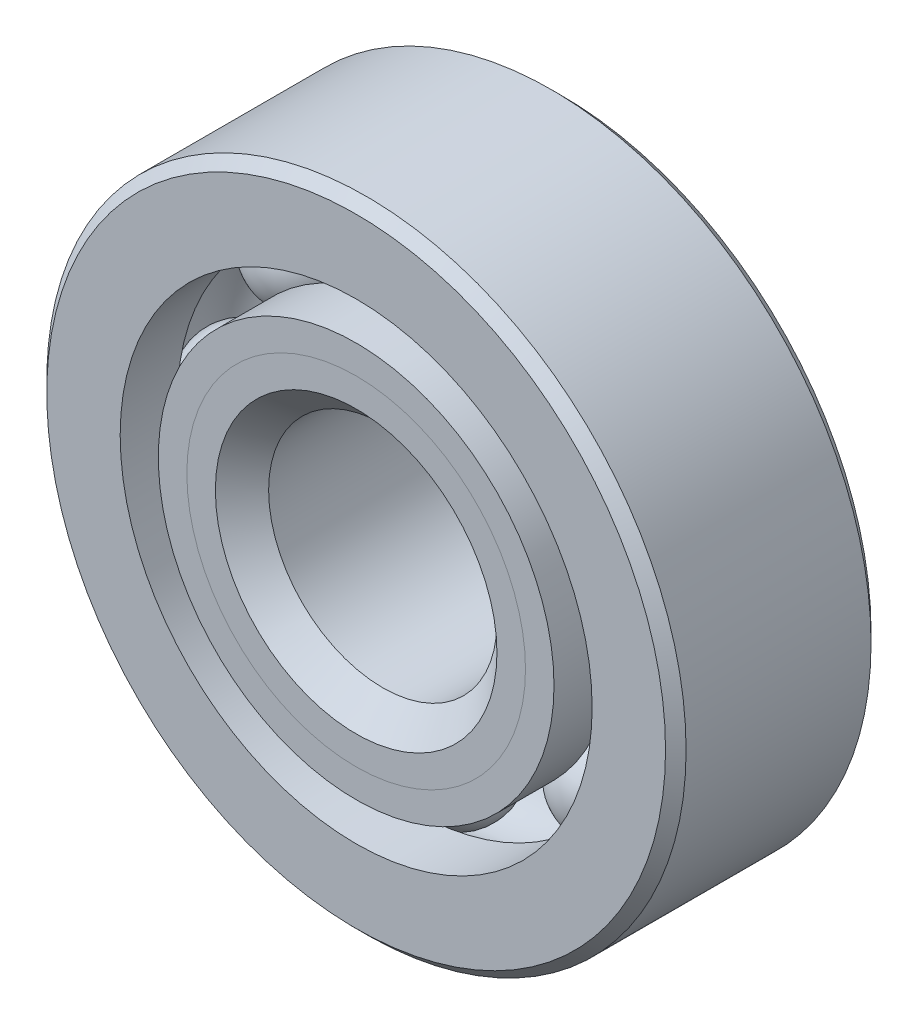
ISO-10303-21;
HEADER;
FILE_DESCRIPTION(('STEP AP214'),'2;1');
FILE_NAME('part.step','',(''),(''),'','','');
FILE_SCHEMA(('AUTOMOTIVE_DESIGN { 1 0 10303 214 1 1 1 1 }'));
ENDSEC;
DATA;
#1=APPLICATION_CONTEXT('core data for automotive mechanical design processes');
#2=APPLICATION_PROTOCOL_DEFINITION('international standard','automotive_design',2000,#1);
#3=PRODUCT_CONTEXT('',#1,'mechanical');
#4=PRODUCT('Part','Part','',(#3));
#5=PRODUCT_RELATED_PRODUCT_CATEGORY('part','',(#4));
#6=PRODUCT_DEFINITION_FORMATION('','',#4);
#7=PRODUCT_DEFINITION_CONTEXT('part definition',#1,'design');
#8=PRODUCT_DEFINITION('design','',#6,#7);
#9=PRODUCT_DEFINITION_SHAPE('','',#8);
#10=(LENGTH_UNIT() NAMED_UNIT(*) SI_UNIT(.MILLI.,.METRE.));
#11=(NAMED_UNIT(*) PLANE_ANGLE_UNIT() SI_UNIT($,.RADIAN.));
#12=(NAMED_UNIT(*) SI_UNIT($,.STERADIAN.) SOLID_ANGLE_UNIT());
#13=UNCERTAINTY_MEASURE_WITH_UNIT(LENGTH_MEASURE(1.E-05),#10,'distance_accuracy_value','');
#14=(GEOMETRIC_REPRESENTATION_CONTEXT(3) GLOBAL_UNCERTAINTY_ASSIGNED_CONTEXT((#13)) GLOBAL_UNIT_ASSIGNED_CONTEXT((#10,
#11,#12)) REPRESENTATION_CONTEXT('',''));
#15=CARTESIAN_POINT('',(0.,0.,0.));
#16=DIRECTION('',(0.,0.,1.));
#17=DIRECTION('',(1.,0.,0.));
#18=AXIS2_PLACEMENT_3D('',#15,#16,#17);
#19=CARTESIAN_POINT('',(-5.33202707188474,5.33202707188487,0.));
#20=DIRECTION('',(0.,0.,1.));
#21=DIRECTION('',(-0.707106781186539,0.707106781186556,0.));
#22=AXIS2_PLACEMENT_3D('',#19,#20,#21);
#23=SPHERICAL_SURFACE('',#22,1.72035132641561);
#24=CARTESIAN_POINT('',(-5.33202707188474,5.33202707188487,1.72035132641561));
#25=VERTEX_POINT('',#24);
#26=VERTEX_LOOP('',#25);
#27=FACE_BOUND('',#26,.T.);
#28=ADVANCED_FACE('F37',(#27),#23,.T.);
#29=CLOSED_SHELL('',(#28));
#30=MANIFOLD_SOLID_BREP('B2',#29);
#31=CARTESIAN_POINT('',(-7.540625,0.,0.));
#32=DIRECTION('',(0.,0.,1.));
#33=DIRECTION('',(-1.,0.,0.));
#34=AXIS2_PLACEMENT_3D('',#31,#32,#33);
#35=SPHERICAL_SURFACE('',#34,1.72035132641561);
#36=CARTESIAN_POINT('',(-7.540625,0.,1.72035132641561));
#37=VERTEX_POINT('',#36);
#38=VERTEX_LOOP('',#37);
#39=FACE_BOUND('',#38,.T.);
#40=ADVANCED_FACE('F68',(#39),#35,.T.);
#41=CLOSED_SHELL('',(#40));
#42=MANIFOLD_SOLID_BREP('B6',#41);
#43=CARTESIAN_POINT('',(-5.33202707188486,-5.33202707188476,0.));
#44=DIRECTION('',(0.,0.,1.));
#45=DIRECTION('',(-0.707106781186554,-0.707106781186541,0.));
#46=AXIS2_PLACEMENT_3D('',#43,#44,#45);
#47=SPHERICAL_SURFACE('',#46,1.72035132641561);
#48=CARTESIAN_POINT('',(-5.33202707188486,-5.33202707188476,1.72035132641561));
#49=VERTEX_POINT('',#48);
#50=VERTEX_LOOP('',#49);
#51=FACE_BOUND('',#50,.T.);
#52=ADVANCED_FACE('F97',(#51),#47,.T.);
#53=CLOSED_SHELL('',(#52));
#54=MANIFOLD_SOLID_BREP('B33',#53);
#55=CARTESIAN_POINT('',(0.,-7.540625,0.));
#56=DIRECTION('',(0.,0.,1.));
#57=DIRECTION('',(0.,-1.,0.));
#58=AXIS2_PLACEMENT_3D('',#55,#56,#57);
#59=SPHERICAL_SURFACE('',#58,1.72035132641561);
#60=CARTESIAN_POINT('',(0.,-7.540625,1.72035132641561));
#61=VERTEX_POINT('',#60);
#62=VERTEX_LOOP('',#61);
#63=FACE_BOUND('',#62,.T.);
#64=ADVANCED_FACE('F126',(#63),#59,.T.);
#65=CLOSED_SHELL('',(#64));
#66=MANIFOLD_SOLID_BREP('B64',#65);
#67=CARTESIAN_POINT('',(5.33202707188478,-5.33202707188484,0.));
#68=DIRECTION('',(0.,0.,1.));
#69=DIRECTION('',(0.707106781186544,-0.707106781186551,0.));
#70=AXIS2_PLACEMENT_3D('',#67,#68,#69);
#71=SPHERICAL_SURFACE('',#70,1.72035132641561);
#72=CARTESIAN_POINT('',(5.33202707188478,-5.33202707188484,1.72035132641561));
#73=VERTEX_POINT('',#72);
#74=VERTEX_LOOP('',#73);
#75=FACE_BOUND('',#74,.T.);
#76=ADVANCED_FACE('F157',(#75),#71,.T.);
#77=CLOSED_SHELL('',(#76));
#78=MANIFOLD_SOLID_BREP('B93',#77);
#79=CARTESIAN_POINT('',(7.540625,0.,0.));
#80=DIRECTION('',(0.,0.,1.));
#81=DIRECTION('',(1.,0.,0.));
#82=AXIS2_PLACEMENT_3D('',#79,#80,#81);
#83=SPHERICAL_SURFACE('',#82,1.72035132641561);
#84=CARTESIAN_POINT('',(7.540625,0.,1.72035132641561));
#85=VERTEX_POINT('',#84);
#86=VERTEX_LOOP('',#85);
#87=FACE_BOUND('',#86,.T.);
#88=ADVANCED_FACE('F188',(#87),#83,.T.);
#89=CLOSED_SHELL('',(#88));
#90=MANIFOLD_SOLID_BREP('B122',#89);
#91=CARTESIAN_POINT('',(5.33202707188482,5.3320270718848,0.));
#92=DIRECTION('',(0.,0.,1.));
#93=DIRECTION('',(0.707106781186549,0.707106781186546,0.));
#94=AXIS2_PLACEMENT_3D('',#91,#92,#93);
#95=SPHERICAL_SURFACE('',#94,1.72035132641561);
#96=CARTESIAN_POINT('',(5.33202707188482,5.3320270718848,1.72035132641561));
#97=VERTEX_POINT('',#96);
#98=VERTEX_LOOP('',#97);
#99=FACE_BOUND('',#98,.T.);
#100=ADVANCED_FACE('F217',(#99),#95,.T.);
#101=CLOSED_SHELL('',(#100));
#102=MANIFOLD_SOLID_BREP('B153',#101);
#103=CARTESIAN_POINT('',(0.,7.540625,0.));
#104=DIRECTION('',(0.,0.,1.));
#105=DIRECTION('',(0.,1.,0.));
#106=AXIS2_PLACEMENT_3D('',#103,#104,#105);
#107=SPHERICAL_SURFACE('',#106,1.72035132641561);
#108=CARTESIAN_POINT('',(0.,7.540625,1.72035132641561));
#109=VERTEX_POINT('',#108);
#110=VERTEX_LOOP('',#109);
#111=FACE_BOUND('',#110,.T.);
#112=ADVANCED_FACE('F250',(#111),#107,.T.);
#113=CLOSED_SHELL('',(#112));
#114=MANIFOLD_SOLID_BREP('B184',#113);
#115=CARTESIAN_POINT('',(0.,5.88611237444005,3.571875));
#116=DIRECTION('',(0.,0.,-1.));
#117=DIRECTION('',(-1.,0.,0.));
#118=AXIS2_PLACEMENT_3D('',#115,#116,#117);
#119=PLANE('',#118);
#120=CARTESIAN_POINT('',(0.,0.,3.571875));
#121=DIRECTION('',(0.,0.,1.));
#122=DIRECTION('',(1.,0.,0.));
#123=AXIS2_PLACEMENT_3D('',#120,#121,#122);
#124=CIRCLE('',#123,4.89451183679219);
#125=CARTESIAN_POINT('',(4.89451183679219,0.,3.571875));
#126=VERTEX_POINT('',#125);
#127=EDGE_CURVE('E304',#126,#126,#124,.T.);
#128=ORIENTED_EDGE('',*,*,#127,.F.);
#129=EDGE_LOOP('',(#128));
#130=FACE_BOUND('',#129,.T.);
#131=CARTESIAN_POINT('',(0.,0.,3.571875));
#132=DIRECTION('',(0.,0.,1.));
#133=DIRECTION('',(1.,0.,0.));
#134=AXIS2_PLACEMENT_3D('',#131,#132,#133);
#135=CIRCLE('',#134,5.88611237444005);
#136=CARTESIAN_POINT('',(5.88611237444005,0.,3.571875));
#137=VERTEX_POINT('',#136);
#138=EDGE_CURVE('E249',#137,#137,#135,.T.);
#139=ORIENTED_EDGE('',*,*,#138,.T.);
#140=EDGE_LOOP('',(#139));
#141=FACE_BOUND('',#140,.T.);
#142=ADVANCED_FACE('F270',(#130,#141),#119,.F.);
#143=CARTESIAN_POINT('',(0.,0.,2.58027446235214));
#144=DIRECTION('',(0.,0.,1.));
#145=DIRECTION('',(1.,0.,0.));
#146=AXIS2_PLACEMENT_3D('',#143,#144,#145);
#147=CONICAL_SURFACE('',#146,4.89451183679219,0.78539816339745);
#148=ORIENTED_EDGE('',*,*,#138,.F.);
#149=EDGE_LOOP('',(#148));
#150=FACE_BOUND('',#149,.T.);
#151=CARTESIAN_POINT('',(0.,0.,2.58027446235214));
#152=DIRECTION('',(0.,0.,1.));
#153=DIRECTION('',(1.,0.,0.));
#154=AXIS2_PLACEMENT_3D('',#151,#152,#153);
#155=CIRCLE('',#154,4.89451183679219);
#156=CARTESIAN_POINT('',(4.89451183679219,0.,2.58027446235214));
#157=VERTEX_POINT('',#156);
#158=EDGE_CURVE('E276',#157,#157,#155,.T.);
#159=ORIENTED_EDGE('',*,*,#158,.T.);
#160=EDGE_LOOP('',(#159));
#161=FACE_BOUND('',#160,.T.);
#162=ADVANCED_FACE('F311',(#150,#161),#147,.T.);
#163=CARTESIAN_POINT('',(0.,0.,3.571875));
#164=DIRECTION('',(0.,0.,1.));
#165=DIRECTION('',(1.,0.,0.));
#166=AXIS2_PLACEMENT_3D('',#163,#164,#165);
#167=CYLINDRICAL_SURFACE('',#166,4.89451183679219);
#168=ORIENTED_EDGE('',*,*,#158,.F.);
#169=EDGE_LOOP('',(#168));
#170=FACE_BOUND('',#169,.T.);
#171=CARTESIAN_POINT('',(0.,0.,0.));
#172=DIRECTION('',(0.,0.,1.));
#173=DIRECTION('',(1.,0.,0.));
#174=AXIS2_PLACEMENT_3D('',#171,#172,#173);
#175=CIRCLE('',#174,4.89451183679219);
#176=CARTESIAN_POINT('',(4.89451183679219,0.,0.));
#177=VERTEX_POINT('',#176);
#178=EDGE_CURVE('E280',#177,#177,#175,.T.);
#179=ORIENTED_EDGE('',*,*,#178,.T.);
#180=EDGE_LOOP('',(#179));
#181=FACE_BOUND('',#180,.T.);
#182=ADVANCED_FACE('F315',(#170,#181),#167,.T.);
#183=CARTESIAN_POINT('',(0.,4.89451183679219,0.));
#184=DIRECTION('',(0.,0.,-1.));
#185=DIRECTION('',(-1.,0.,0.));
#186=AXIS2_PLACEMENT_3D('',#183,#184,#185);
#187=PLANE('',#186);
#188=ORIENTED_EDGE('',*,*,#178,.F.);
#189=EDGE_LOOP('',(#188));
#190=FACE_BOUND('',#189,.T.);
#191=CARTESIAN_POINT('',(0.,0.,0.));
#192=DIRECTION('',(0.,0.,1.));
#193=DIRECTION('',(1.,0.,0.));
#194=AXIS2_PLACEMENT_3D('',#191,#192,#193);
#195=CIRCLE('',#194,5.82027367358438);
#196=CARTESIAN_POINT('',(5.82027367358438,0.,0.));
#197=VERTEX_POINT('',#196);
#198=EDGE_CURVE('E284',#197,#197,#195,.T.);
#199=ORIENTED_EDGE('',*,*,#198,.T.);
#200=EDGE_LOOP('',(#199));
#201=FACE_BOUND('',#200,.T.);
#202=ADVANCED_FACE('F320',(#190,#201),#187,.F.);
#203=CARTESIAN_POINT('',(0.,0.,0.));
#204=DIRECTION('',(0.,0.,1.));
#205=DIRECTION('',(1.,0.,0.));
#206=AXIS2_PLACEMENT_3D('',#203,#204,#205);
#207=TOROIDAL_SURFACE('',#206,7.540625,1.72035132641561);
#208=ORIENTED_EDGE('',*,*,#198,.F.);
#209=EDGE_LOOP('',(#208));
#210=FACE_BOUND('',#209,.T.);
#211=CARTESIAN_POINT('',(0.,0.,-1.5875));
#212=DIRECTION('',(0.,0.,1.));
#213=DIRECTION('',(1.,0.,0.));
#214=AXIS2_PLACEMENT_3D('',#211,#212,#213);
#215=CIRCLE('',#214,6.87771291208791);
#216=CARTESIAN_POINT('',(6.87771291208791,0.,-1.5875));
#217=VERTEX_POINT('',#216);
#218=EDGE_CURVE('E289',#217,#217,#215,.T.);
#219=ORIENTED_EDGE('',*,*,#218,.T.);
#220=EDGE_LOOP('',(#219));
#221=FACE_BOUND('',#220,.T.);
#222=ADVANCED_FACE('F326',(#210,#221),#207,.F.);
#223=CARTESIAN_POINT('',(0.,0.,3.571875));
#224=DIRECTION('',(0.,0.,1.));
#225=DIRECTION('',(1.,0.,0.));
#226=AXIS2_PLACEMENT_3D('',#223,#224,#225);
#227=CYLINDRICAL_SURFACE('',#226,6.87771291208791);
#228=ORIENTED_EDGE('',*,*,#218,.F.);
#229=EDGE_LOOP('',(#228));
#230=FACE_BOUND('',#229,.T.);
#231=CARTESIAN_POINT('',(0.,0.,-3.571875));
#232=DIRECTION('',(0.,0.,1.));
#233=DIRECTION('',(1.,0.,0.));
#234=AXIS2_PLACEMENT_3D('',#231,#232,#233);
#235=CIRCLE('',#234,6.87771291208791);
#236=CARTESIAN_POINT('',(6.87771291208791,0.,-3.571875));
#237=VERTEX_POINT('',#236);
#238=EDGE_CURVE('E292',#237,#237,#235,.T.);
#239=ORIENTED_EDGE('',*,*,#238,.T.);
#240=EDGE_LOOP('',(#239));
#241=FACE_BOUND('',#240,.T.);
#242=ADVANCED_FACE('F330',(#230,#241),#227,.T.);
#243=CARTESIAN_POINT('',(0.,4.3259375,-3.571875));
#244=DIRECTION('',(0.,0.,1.));
#245=DIRECTION('',(1.,0.,0.));
#246=AXIS2_PLACEMENT_3D('',#243,#244,#245);
#247=PLANE('',#246);
#248=ORIENTED_EDGE('',*,*,#238,.F.);
#249=EDGE_LOOP('',(#248));
#250=FACE_BOUND('',#249,.T.);
#251=CARTESIAN_POINT('',(0.,0.,-3.571875));
#252=DIRECTION('',(0.,0.,1.));
#253=DIRECTION('',(1.,0.,0.));
#254=AXIS2_PLACEMENT_3D('',#251,#252,#253);
#255=CIRCLE('',#254,4.3259375);
#256=CARTESIAN_POINT('',(4.3259375,0.,-3.571875));
#257=VERTEX_POINT('',#256);
#258=EDGE_CURVE('E295',#257,#257,#255,.T.);
#259=ORIENTED_EDGE('',*,*,#258,.T.);
#260=EDGE_LOOP('',(#259));
#261=FACE_BOUND('',#260,.T.);
#262=ADVANCED_FACE('F334',(#250,#261),#247,.F.);
#263=CARTESIAN_POINT('',(0.,0.,-3.2146875));
#264=DIRECTION('',(0.,0.,-1.));
#265=DIRECTION('',(-1.,0.,0.));
#266=AXIS2_PLACEMENT_3D('',#263,#264,#265);
#267=CONICAL_SURFACE('',#266,3.96875,0.785398163397445);
#268=ORIENTED_EDGE('',*,*,#258,.F.);
#269=EDGE_LOOP('',(#268));
#270=FACE_BOUND('',#269,.T.);
#271=CARTESIAN_POINT('',(0.,0.,-3.2146875));
#272=DIRECTION('',(0.,0.,1.));
#273=DIRECTION('',(1.,0.,0.));
#274=AXIS2_PLACEMENT_3D('',#271,#272,#273);
#275=CIRCLE('',#274,3.96875);
#276=CARTESIAN_POINT('',(3.96875,0.,-3.2146875));
#277=VERTEX_POINT('',#276);
#278=EDGE_CURVE('E298',#277,#277,#275,.T.);
#279=ORIENTED_EDGE('',*,*,#278,.T.);
#280=EDGE_LOOP('',(#279));
#281=FACE_BOUND('',#280,.T.);
#282=ADVANCED_FACE('F338',(#270,#281),#267,.F.);
#283=CARTESIAN_POINT('',(0.,0.,3.571875));
#284=DIRECTION('',(0.,0.,1.));
#285=DIRECTION('',(1.,0.,0.));
#286=AXIS2_PLACEMENT_3D('',#283,#284,#285);
#287=CYLINDRICAL_SURFACE('',#286,3.96875);
#288=ORIENTED_EDGE('',*,*,#278,.F.);
#289=EDGE_LOOP('',(#288));
#290=FACE_BOUND('',#289,.T.);
#291=CARTESIAN_POINT('',(0.,0.,2.64611316320781));
#292=DIRECTION('',(0.,0.,1.));
#293=DIRECTION('',(1.,0.,0.));
#294=AXIS2_PLACEMENT_3D('',#291,#292,#293);
#295=CIRCLE('',#294,3.96875);
#296=CARTESIAN_POINT('',(3.96875,0.,2.64611316320781));
#297=VERTEX_POINT('',#296);
#298=EDGE_CURVE('E301',#297,#297,#295,.T.);
#299=ORIENTED_EDGE('',*,*,#298,.T.);
#300=EDGE_LOOP('',(#299));
#301=FACE_BOUND('',#300,.T.);
#302=ADVANCED_FACE('F342',(#290,#301),#287,.F.);
#303=CARTESIAN_POINT('',(0.,0.,3.571875));
#304=DIRECTION('',(0.,0.,1.));
#305=DIRECTION('',(1.,0.,0.));
#306=AXIS2_PLACEMENT_3D('',#303,#304,#305);
#307=CONICAL_SURFACE('',#306,4.89451183679219,0.78539816339745);
#308=ORIENTED_EDGE('',*,*,#298,.F.);
#309=EDGE_LOOP('',(#308));
#310=FACE_BOUND('',#309,.T.);
#311=ORIENTED_EDGE('',*,*,#127,.T.);
#312=EDGE_LOOP('',(#311));
#313=FACE_BOUND('',#312,.T.);
#314=ADVANCED_FACE('F308',(#310,#313),#307,.F.);
#315=CLOSED_SHELL('',(#142,#162,#182,#202,#222,#242,#262,#282,#302,#314));
#316=MANIFOLD_SOLID_BREP('B213',#315);
#317=CARTESIAN_POINT('',(0.,6.87771291208791,3.571875));
#318=DIRECTION('',(0.,0.,-1.));
#319=DIRECTION('',(-1.,0.,0.));
#320=AXIS2_PLACEMENT_3D('',#317,#318,#319);
#321=PLANE('',#320);
#322=CARTESIAN_POINT('',(0.,0.,3.571875));
#323=DIRECTION('',(0.,0.,1.));
#324=DIRECTION('',(1.,0.,0.));
#325=AXIS2_PLACEMENT_3D('',#322,#323,#324);
#326=CIRCLE('',#325,5.88611237444005);
#327=CARTESIAN_POINT('',(5.88611237444005,0.,3.571875));
#328=VERTEX_POINT('',#327);
#329=EDGE_CURVE('E269',#328,#328,#326,.T.);
#330=ORIENTED_EDGE('',*,*,#329,.F.);
#331=EDGE_LOOP('',(#330));
#332=FACE_BOUND('',#331,.T.);
#333=CARTESIAN_POINT('',(0.,0.,3.571875));
#334=DIRECTION('',(0.,0.,1.));
#335=DIRECTION('',(1.,0.,0.));
#336=AXIS2_PLACEMENT_3D('',#333,#334,#335);
#337=CIRCLE('',#336,6.87771291208791);
#338=CARTESIAN_POINT('',(6.87771291208791,0.,3.571875));
#339=VERTEX_POINT('',#338);
#340=EDGE_CURVE('E450',#339,#339,#337,.T.);
#341=ORIENTED_EDGE('',*,*,#340,.T.);
#342=EDGE_LOOP('',(#341));
#343=FACE_BOUND('',#342,.T.);
#344=ADVANCED_FACE('F428',(#332,#343),#321,.F.);
#345=CARTESIAN_POINT('',(0.,0.,3.571875));
#346=DIRECTION('',(0.,0.,1.));
#347=DIRECTION('',(1.,0.,0.));
#348=AXIS2_PLACEMENT_3D('',#345,#346,#347);
#349=CONICAL_SURFACE('',#348,5.88611237444005,0.78539816339745);
#350=CARTESIAN_POINT('',(0.,0.,2.58027446235214));
#351=DIRECTION('',(0.,0.,1.));
#352=DIRECTION('',(1.,0.,0.));
#353=AXIS2_PLACEMENT_3D('',#350,#351,#352);
#354=CIRCLE('',#353,4.89451183679219);
#355=CARTESIAN_POINT('',(4.89451183679219,0.,2.58027446235214));
#356=VERTEX_POINT('',#355);
#357=EDGE_CURVE('E434',#356,#356,#354,.T.);
#358=ORIENTED_EDGE('',*,*,#357,.F.);
#359=EDGE_LOOP('',(#358));
#360=FACE_BOUND('',#359,.T.);
#361=ORIENTED_EDGE('',*,*,#329,.T.);
#362=EDGE_LOOP('',(#361));
#363=FACE_BOUND('',#362,.T.);
#364=ADVANCED_FACE('F475',(#360,#363),#349,.F.);
#365=CARTESIAN_POINT('',(0.,0.,3.571875));
#366=DIRECTION('',(0.,0.,1.));
#367=DIRECTION('',(1.,0.,0.));
#368=AXIS2_PLACEMENT_3D('',#365,#366,#367);
#369=CYLINDRICAL_SURFACE('',#368,4.89451183679219);
#370=CARTESIAN_POINT('',(0.,0.,0.));
#371=DIRECTION('',(0.,0.,1.));
#372=DIRECTION('',(1.,0.,0.));
#373=AXIS2_PLACEMENT_3D('',#370,#371,#372);
#374=CIRCLE('',#373,4.89451183679219);
#375=CARTESIAN_POINT('',(4.89451183679219,0.,0.));
#376=VERTEX_POINT('',#375);
#377=EDGE_CURVE('E438',#376,#376,#374,.T.);
#378=ORIENTED_EDGE('',*,*,#377,.F.);
#379=EDGE_LOOP('',(#378));
#380=FACE_BOUND('',#379,.T.);
#381=ORIENTED_EDGE('',*,*,#357,.T.);
#382=EDGE_LOOP('',(#381));
#383=FACE_BOUND('',#382,.T.);
#384=ADVANCED_FACE('F470',(#380,#383),#369,.F.);
#385=CARTESIAN_POINT('',(0.,4.89451183679219,0.));
#386=DIRECTION('',(0.,0.,1.));
#387=DIRECTION('',(1.,0.,0.));
#388=AXIS2_PLACEMENT_3D('',#385,#386,#387);
#389=PLANE('',#388);
#390=CARTESIAN_POINT('',(0.,0.,0.));
#391=DIRECTION('',(0.,0.,1.));
#392=DIRECTION('',(1.,0.,0.));
#393=AXIS2_PLACEMENT_3D('',#390,#391,#392);
#394=CIRCLE('',#393,5.82027367358438);
#395=CARTESIAN_POINT('',(5.82027367358438,0.,0.));
#396=VERTEX_POINT('',#395);
#397=EDGE_CURVE('E442',#396,#396,#394,.T.);
#398=ORIENTED_EDGE('',*,*,#397,.F.);
#399=EDGE_LOOP('',(#398));
#400=FACE_BOUND('',#399,.T.);
#401=ORIENTED_EDGE('',*,*,#377,.T.);
#402=EDGE_LOOP('',(#401));
#403=FACE_BOUND('',#402,.T.);
#404=ADVANCED_FACE('F464',(#400,#403),#389,.F.);
#405=CARTESIAN_POINT('',(0.,0.,0.));
#406=DIRECTION('',(0.,0.,1.));
#407=DIRECTION('',(1.,0.,0.));
#408=AXIS2_PLACEMENT_3D('',#405,#406,#407);
#409=TOROIDAL_SURFACE('',#408,7.540625,1.72035132641561);
#410=CARTESIAN_POINT('',(0.,0.,1.5875));
#411=DIRECTION('',(0.,0.,1.));
#412=DIRECTION('',(1.,0.,0.));
#413=AXIS2_PLACEMENT_3D('',#410,#411,#412);
#414=CIRCLE('',#413,6.87771291208791);
#415=CARTESIAN_POINT('',(6.87771291208791,0.,1.5875));
#416=VERTEX_POINT('',#415);
#417=EDGE_CURVE('E447',#416,#416,#414,.T.);
#418=ORIENTED_EDGE('',*,*,#417,.F.);
#419=EDGE_LOOP('',(#418));
#420=FACE_BOUND('',#419,.T.);
#421=ORIENTED_EDGE('',*,*,#397,.T.);
#422=EDGE_LOOP('',(#421));
#423=FACE_BOUND('',#422,.T.);
#424=ADVANCED_FACE('F458',(#420,#423),#409,.F.);
#425=CARTESIAN_POINT('',(0.,0.,3.571875));
#426=DIRECTION('',(0.,0.,1.));
#427=DIRECTION('',(1.,0.,0.));
#428=AXIS2_PLACEMENT_3D('',#425,#426,#427);
#429=CYLINDRICAL_SURFACE('',#428,6.87771291208791);
#430=ORIENTED_EDGE('',*,*,#340,.F.);
#431=EDGE_LOOP('',(#430));
#432=FACE_BOUND('',#431,.T.);
#433=ORIENTED_EDGE('',*,*,#417,.T.);
#434=EDGE_LOOP('',(#433));
#435=FACE_BOUND('',#434,.T.);
#436=ADVANCED_FACE('F455',(#432,#435),#429,.T.);
#437=CLOSED_SHELL('',(#344,#364,#384,#404,#424,#436));
#438=MANIFOLD_SOLID_BREP('B244',#437);
#439=CARTESIAN_POINT('',(0.,0.,3.2146875));
#440=DIRECTION('',(0.,0.,-1.));
#441=DIRECTION('',(-1.,0.,0.));
#442=AXIS2_PLACEMENT_3D('',#439,#440,#441);
#443=CONICAL_SURFACE('',#442,11.1125,0.785398163397448);
#444=CARTESIAN_POINT('',(0.,0.,3.571875));
#445=DIRECTION('',(0.,0.,1.));
#446=DIRECTION('',(1.,0.,0.));
#447=AXIS2_PLACEMENT_3D('',#444,#445,#446);
#448=CIRCLE('',#447,10.7553125);
#449=CARTESIAN_POINT('',(10.7553125,0.,3.571875));
#450=VERTEX_POINT('',#449);
#451=EDGE_CURVE('E547',#450,#450,#448,.T.);
#452=ORIENTED_EDGE('',*,*,#451,.F.);
#453=EDGE_LOOP('',(#452));
#454=FACE_BOUND('',#453,.T.);
#455=CARTESIAN_POINT('',(0.,0.,3.2146875));
#456=DIRECTION('',(0.,0.,1.));
#457=DIRECTION('',(1.,0.,0.));
#458=AXIS2_PLACEMENT_3D('',#455,#456,#457);
#459=CIRCLE('',#458,11.1125);
#460=CARTESIAN_POINT('',(11.1125,0.,3.2146875));
#461=VERTEX_POINT('',#460);
#462=EDGE_CURVE('E427',#461,#461,#459,.T.);
#463=ORIENTED_EDGE('',*,*,#462,.T.);
#464=EDGE_LOOP('',(#463));
#465=FACE_BOUND('',#464,.T.);
#466=ADVANCED_FACE('F519',(#454,#465),#443,.T.);
#467=CARTESIAN_POINT('',(0.,0.,3.571875));
#468=DIRECTION('',(0.,0.,1.));
#469=DIRECTION('',(1.,0.,0.));
#470=AXIS2_PLACEMENT_3D('',#467,#468,#469);
#471=CYLINDRICAL_SURFACE('',#470,11.1125);
#472=ORIENTED_EDGE('',*,*,#462,.F.);
#473=EDGE_LOOP('',(#472));
#474=FACE_BOUND('',#473,.T.);
#475=CARTESIAN_POINT('',(0.,0.,-3.2146875));
#476=DIRECTION('',(0.,0.,1.));
#477=DIRECTION('',(1.,0.,0.));
#478=AXIS2_PLACEMENT_3D('',#475,#476,#477);
#479=CIRCLE('',#478,11.1125);
#480=CARTESIAN_POINT('',(11.1125,0.,-3.2146875));
#481=VERTEX_POINT('',#480);
#482=EDGE_CURVE('E525',#481,#481,#479,.T.);
#483=ORIENTED_EDGE('',*,*,#482,.T.);
#484=EDGE_LOOP('',(#483));
#485=FACE_BOUND('',#484,.T.);
#486=ADVANCED_FACE('F554',(#474,#485),#471,.T.);
#487=CARTESIAN_POINT('',(0.,0.,-3.571875));
#488=DIRECTION('',(0.,0.,1.));
#489=DIRECTION('',(1.,0.,0.));
#490=AXIS2_PLACEMENT_3D('',#487,#488,#489);
#491=CONICAL_SURFACE('',#490,10.7553125,0.785398163397446);
#492=ORIENTED_EDGE('',*,*,#482,.F.);
#493=EDGE_LOOP('',(#492));
#494=FACE_BOUND('',#493,.T.);
#495=CARTESIAN_POINT('',(0.,0.,-3.571875));
#496=DIRECTION('',(0.,0.,1.));
#497=DIRECTION('',(1.,0.,0.));
#498=AXIS2_PLACEMENT_3D('',#495,#496,#497);
#499=CIRCLE('',#498,10.7553125);
#500=CARTESIAN_POINT('',(10.7553125,0.,-3.571875));
#501=VERTEX_POINT('',#500);
#502=EDGE_CURVE('E529',#501,#501,#499,.T.);
#503=ORIENTED_EDGE('',*,*,#502,.T.);
#504=EDGE_LOOP('',(#503));
#505=FACE_BOUND('',#504,.T.);
#506=ADVANCED_FACE('F558',(#494,#505),#491,.T.);
#507=CARTESIAN_POINT('',(0.,10.7553125,-3.571875));
#508=DIRECTION('',(0.,0.,1.));
#509=DIRECTION('',(1.,0.,0.));
#510=AXIS2_PLACEMENT_3D('',#507,#508,#509);
#511=PLANE('',#510);
#512=ORIENTED_EDGE('',*,*,#502,.F.);
#513=EDGE_LOOP('',(#512));
#514=FACE_BOUND('',#513,.T.);
#515=CARTESIAN_POINT('',(0.,0.,-3.571875));
#516=DIRECTION('',(0.,0.,1.));
#517=DIRECTION('',(1.,0.,0.));
#518=AXIS2_PLACEMENT_3D('',#515,#516,#517);
#519=CIRCLE('',#518,8.20353708791209);
#520=CARTESIAN_POINT('',(8.20353708791209,0.,-3.571875));
#521=VERTEX_POINT('',#520);
#522=EDGE_CURVE('E533',#521,#521,#519,.T.);
#523=ORIENTED_EDGE('',*,*,#522,.T.);
#524=EDGE_LOOP('',(#523));
#525=FACE_BOUND('',#524,.T.);
#526=ADVANCED_FACE('F563',(#514,#525),#511,.F.);
#527=CARTESIAN_POINT('',(0.,0.,3.571875));
#528=DIRECTION('',(0.,0.,1.));
#529=DIRECTION('',(1.,0.,0.));
#530=AXIS2_PLACEMENT_3D('',#527,#528,#529);
#531=CYLINDRICAL_SURFACE('',#530,8.20353708791209);
#532=ORIENTED_EDGE('',*,*,#522,.F.);
#533=EDGE_LOOP('',(#532));
#534=FACE_BOUND('',#533,.T.);
#535=CARTESIAN_POINT('',(0.,0.,-1.5875));
#536=DIRECTION('',(0.,0.,1.));
#537=DIRECTION('',(1.,0.,0.));
#538=AXIS2_PLACEMENT_3D('',#535,#536,#537);
#539=CIRCLE('',#538,8.20353708791209);
#540=CARTESIAN_POINT('',(8.20353708791209,0.,-1.5875));
#541=VERTEX_POINT('',#540);
#542=EDGE_CURVE('E538',#541,#541,#539,.T.);
#543=ORIENTED_EDGE('',*,*,#542,.T.);
#544=EDGE_LOOP('',(#543));
#545=FACE_BOUND('',#544,.T.);
#546=ADVANCED_FACE('F569',(#534,#545),#531,.F.);
#547=CARTESIAN_POINT('',(0.,0.,0.));
#548=DIRECTION('',(0.,0.,1.));
#549=DIRECTION('',(1.,0.,0.));
#550=AXIS2_PLACEMENT_3D('',#547,#548,#549);
#551=TOROIDAL_SURFACE('',#550,7.540625,1.72035132641561);
#552=ORIENTED_EDGE('',*,*,#542,.F.);
#553=EDGE_LOOP('',(#552));
#554=FACE_BOUND('',#553,.T.);
#555=CARTESIAN_POINT('',(0.,0.,1.5875));
#556=DIRECTION('',(0.,0.,1.));
#557=DIRECTION('',(1.,0.,0.));
#558=AXIS2_PLACEMENT_3D('',#555,#556,#557);
#559=CIRCLE('',#558,8.20353708791209);
#560=CARTESIAN_POINT('',(8.20353708791209,0.,1.5875));
#561=VERTEX_POINT('',#560);
#562=EDGE_CURVE('E541',#561,#561,#559,.T.);
#563=ORIENTED_EDGE('',*,*,#562,.T.);
#564=EDGE_LOOP('',(#563));
#565=FACE_BOUND('',#564,.T.);
#566=ADVANCED_FACE('F573',(#554,#565),#551,.F.);
#567=CARTESIAN_POINT('',(0.,0.,3.571875));
#568=DIRECTION('',(0.,0.,1.));
#569=DIRECTION('',(1.,0.,0.));
#570=AXIS2_PLACEMENT_3D('',#567,#568,#569);
#571=CYLINDRICAL_SURFACE('',#570,8.20353708791209);
#572=ORIENTED_EDGE('',*,*,#562,.F.);
#573=EDGE_LOOP('',(#572));
#574=FACE_BOUND('',#573,.T.);
#575=CARTESIAN_POINT('',(0.,0.,3.571875));
#576=DIRECTION('',(0.,0.,1.));
#577=DIRECTION('',(1.,0.,0.));
#578=AXIS2_PLACEMENT_3D('',#575,#576,#577);
#579=CIRCLE('',#578,8.20353708791209);
#580=CARTESIAN_POINT('',(8.20353708791209,0.,3.571875));
#581=VERTEX_POINT('',#580);
#582=EDGE_CURVE('E544',#581,#581,#579,.T.);
#583=ORIENTED_EDGE('',*,*,#582,.T.);
#584=EDGE_LOOP('',(#583));
#585=FACE_BOUND('',#584,.T.);
#586=ADVANCED_FACE('F577',(#574,#585),#571,.F.);
#587=CARTESIAN_POINT('',(0.,10.7553125,3.571875));
#588=DIRECTION('',(0.,0.,-1.));
#589=DIRECTION('',(-1.,0.,0.));
#590=AXIS2_PLACEMENT_3D('',#587,#588,#589);
#591=PLANE('',#590);
#592=ORIENTED_EDGE('',*,*,#582,.F.);
#593=EDGE_LOOP('',(#592));
#594=FACE_BOUND('',#593,.T.);
#595=ORIENTED_EDGE('',*,*,#451,.T.);
#596=EDGE_LOOP('',(#595));
#597=FACE_BOUND('',#596,.T.);
#598=ADVANCED_FACE('F551',(#594,#597),#591,.F.);
#599=CLOSED_SHELL('',(#466,#486,#506,#526,#546,#566,#586,#598));
#600=MANIFOLD_SOLID_BREP('B264',#599);
#601=ADVANCED_BREP_SHAPE_REPRESENTATION('',(#18,#30,#42,#54,#66,#78,#90,#102,#114,#316,#438,
#600),#14);
#602=SHAPE_DEFINITION_REPRESENTATION(#9,#601);
ENDSEC;
END-ISO-10303-21;
